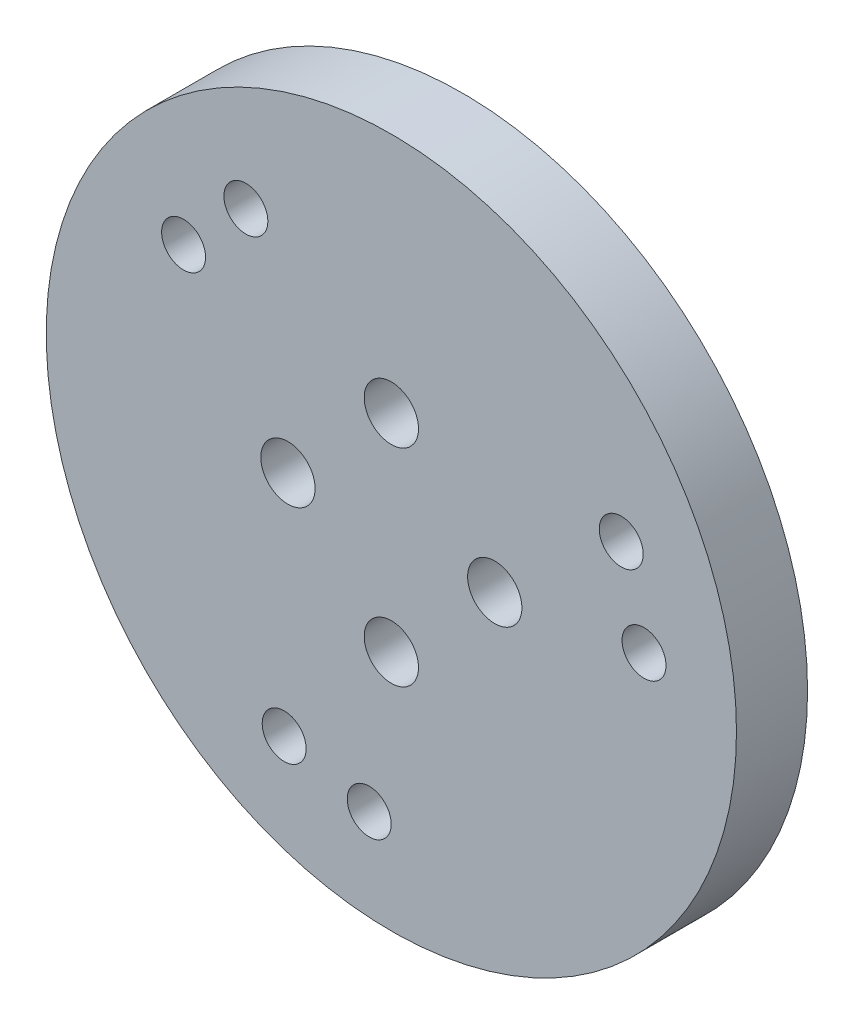
ISO-10303-21;
HEADER;
FILE_DESCRIPTION(('STEP AP214'),'2;1');
FILE_NAME('part.step','',(''),(''),'','','');
FILE_SCHEMA(('AUTOMOTIVE_DESIGN { 1 0 10303 214 1 1 1 1 }'));
ENDSEC;
DATA;
#1=APPLICATION_CONTEXT('core data for automotive mechanical design processes');
#2=APPLICATION_PROTOCOL_DEFINITION('international standard','automotive_design',2000,#1);
#3=PRODUCT_CONTEXT('',#1,'mechanical');
#4=PRODUCT('Part','Part','',(#3));
#5=PRODUCT_RELATED_PRODUCT_CATEGORY('part','',(#4));
#6=PRODUCT_DEFINITION_FORMATION('','',#4);
#7=PRODUCT_DEFINITION_CONTEXT('part definition',#1,'design');
#8=PRODUCT_DEFINITION('design','',#6,#7);
#9=PRODUCT_DEFINITION_SHAPE('','',#8);
#10=(LENGTH_UNIT() NAMED_UNIT(*) SI_UNIT(.MILLI.,.METRE.));
#11=(NAMED_UNIT(*) PLANE_ANGLE_UNIT() SI_UNIT($,.RADIAN.));
#12=(NAMED_UNIT(*) SI_UNIT($,.STERADIAN.) SOLID_ANGLE_UNIT());
#13=UNCERTAINTY_MEASURE_WITH_UNIT(LENGTH_MEASURE(1.E-05),#10,'distance_accuracy_value','');
#14=(GEOMETRIC_REPRESENTATION_CONTEXT(3) GLOBAL_UNCERTAINTY_ASSIGNED_CONTEXT((#13)) GLOBAL_UNIT_ASSIGNED_CONTEXT((#10,
#11,#12)) REPRESENTATION_CONTEXT('',''));
#15=CARTESIAN_POINT('',(0.,0.,0.));
#16=DIRECTION('',(0.,0.,1.));
#17=DIRECTION('',(1.,0.,0.));
#18=AXIS2_PLACEMENT_3D('',#15,#16,#17);
#19=CARTESIAN_POINT('',(-11.2547168340798,16.0734014130389,12.5));
#20=DIRECTION('',(0.,0.,-1.));
#21=DIRECTION('',(-1.,0.,0.));
#22=AXIS2_PLACEMENT_3D('',#19,#20,#21);
#23=CYLINDRICAL_SURFACE('',#22,1.7);
#24=CARTESIAN_POINT('',(-11.2547168340798,16.0734014130389,12.5));
#25=DIRECTION('',(0.,0.,1.));
#26=DIRECTION('',(1.,0.,0.));
#27=AXIS2_PLACEMENT_3D('',#24,#25,#26);
#28=CIRCLE('',#27,1.7);
#29=CARTESIAN_POINT('',(-9.55471683407982,16.0734014130389,12.5));
#30=VERTEX_POINT('',#29);
#31=EDGE_CURVE('E123',#30,#30,#28,.T.);
#32=ORIENTED_EDGE('',*,*,#31,.T.);
#33=EDGE_LOOP('',(#32));
#34=FACE_BOUND('',#33,.T.);
#35=CARTESIAN_POINT('',(-11.2547168340798,16.0734014130389,9.5));
#36=DIRECTION('',(0.,0.,-1.));
#37=DIRECTION('',(-1.,0.,0.));
#38=AXIS2_PLACEMENT_3D('',#35,#36,#37);
#39=CIRCLE('',#38,1.7);
#40=CARTESIAN_POINT('',(-12.9547168340798,16.0734014130389,9.5));
#41=VERTEX_POINT('',#40);
#42=EDGE_CURVE('E82',#41,#41,#39,.T.);
#43=ORIENTED_EDGE('',*,*,#42,.T.);
#44=EDGE_LOOP('',(#43));
#45=FACE_BOUND('',#44,.T.);
#46=ADVANCED_FACE('F33',(#34,#45),#23,.F.);
#47=CARTESIAN_POINT('',(-16.0734014130383,11.2547168340806,12.5));
#48=DIRECTION('',(0.,0.,-1.));
#49=DIRECTION('',(-1.,0.,0.));
#50=AXIS2_PLACEMENT_3D('',#47,#48,#49);
#51=CYLINDRICAL_SURFACE('',#50,1.7);
#52=CARTESIAN_POINT('',(-16.0734014130383,11.2547168340806,12.5));
#53=DIRECTION('',(0.,0.,1.));
#54=DIRECTION('',(1.,0.,0.));
#55=AXIS2_PLACEMENT_3D('',#52,#53,#54);
#56=CIRCLE('',#55,1.7);
#57=CARTESIAN_POINT('',(-14.3734014130383,11.2547168340806,12.5));
#58=VERTEX_POINT('',#57);
#59=EDGE_CURVE('E131',#58,#58,#56,.T.);
#60=ORIENTED_EDGE('',*,*,#59,.T.);
#61=EDGE_LOOP('',(#60));
#62=FACE_BOUND('',#61,.T.);
#63=CARTESIAN_POINT('',(-16.0734014130383,11.2547168340806,9.5));
#64=DIRECTION('',(0.,0.,-1.));
#65=DIRECTION('',(-1.,0.,0.));
#66=AXIS2_PLACEMENT_3D('',#63,#64,#65);
#67=CIRCLE('',#66,1.7);
#68=CARTESIAN_POINT('',(-17.7734014130383,11.2547168340806,9.5));
#69=VERTEX_POINT('',#68);
#70=EDGE_CURVE('E79',#69,#69,#67,.T.);
#71=ORIENTED_EDGE('',*,*,#70,.T.);
#72=EDGE_LOOP('',(#71));
#73=FACE_BOUND('',#72,.T.);
#74=ADVANCED_FACE('F201',(#62,#73),#51,.F.);
#75=CARTESIAN_POINT('',(19.5473323659569,1.71016998419536,12.5));
#76=DIRECTION('',(0.,0.,-1.));
#77=DIRECTION('',(-1.,0.,0.));
#78=AXIS2_PLACEMENT_3D('',#75,#76,#77);
#79=CYLINDRICAL_SURFACE('',#78,1.70000000000149);
#80=CARTESIAN_POINT('',(19.5473323659569,1.71016998419536,12.5));
#81=DIRECTION('',(0.,0.,1.));
#82=DIRECTION('',(1.,0.,0.));
#83=AXIS2_PLACEMENT_3D('',#80,#81,#82);
#84=CIRCLE('',#83,1.70000000000149);
#85=CARTESIAN_POINT('',(21.2473323659584,1.71016998419536,12.5));
#86=VERTEX_POINT('',#85);
#87=EDGE_CURVE('E119',#86,#86,#84,.T.);
#88=ORIENTED_EDGE('',*,*,#87,.T.);
#89=EDGE_LOOP('',(#88));
#90=FACE_BOUND('',#89,.T.);
#91=CARTESIAN_POINT('',(19.5473323659569,1.71016998419536,9.5));
#92=DIRECTION('',(0.,0.,-1.));
#93=DIRECTION('',(-1.,0.,0.));
#94=AXIS2_PLACEMENT_3D('',#91,#92,#93);
#95=CIRCLE('',#94,1.70000000000149);
#96=CARTESIAN_POINT('',(17.8473323659554,1.71016998419536,9.5));
#97=VERTEX_POINT('',#96);
#98=EDGE_CURVE('E76',#97,#97,#95,.T.);
#99=ORIENTED_EDGE('',*,*,#98,.T.);
#100=EDGE_LOOP('',(#99));
#101=FACE_BOUND('',#100,.T.);
#102=ADVANCED_FACE('F207',(#90,#101),#79,.F.);
#103=CARTESIAN_POINT('',(-8.29261553187502,-17.7835713972328,12.5));
#104=DIRECTION('',(0.,0.,-1.));
#105=DIRECTION('',(-1.,0.,0.));
#106=AXIS2_PLACEMENT_3D('',#103,#104,#105);
#107=CYLINDRICAL_SURFACE('',#106,1.70000000000115);
#108=CARTESIAN_POINT('',(-8.29261553187502,-17.7835713972328,12.5));
#109=DIRECTION('',(0.,0.,1.));
#110=DIRECTION('',(1.,0.,0.));
#111=AXIS2_PLACEMENT_3D('',#108,#109,#110);
#112=CIRCLE('',#111,1.70000000000115);
#113=CARTESIAN_POINT('',(-6.59261553187387,-17.7835713972328,12.5));
#114=VERTEX_POINT('',#113);
#115=EDGE_CURVE('E115',#114,#114,#112,.T.);
#116=ORIENTED_EDGE('',*,*,#115,.T.);
#117=EDGE_LOOP('',(#116));
#118=FACE_BOUND('',#117,.T.);
#119=CARTESIAN_POINT('',(-8.29261553187502,-17.7835713972328,9.5));
#120=DIRECTION('',(0.,0.,-1.));
#121=DIRECTION('',(-1.,0.,0.));
#122=AXIS2_PLACEMENT_3D('',#119,#120,#121);
#123=CIRCLE('',#122,1.70000000000115);
#124=CARTESIAN_POINT('',(-9.99261553187616,-17.7835713972328,9.5));
#125=VERTEX_POINT('',#124);
#126=EDGE_CURVE('E72',#125,#125,#123,.T.);
#127=ORIENTED_EDGE('',*,*,#126,.T.);
#128=EDGE_LOOP('',(#127));
#129=FACE_BOUND('',#128,.T.);
#130=ADVANCED_FACE('F496',(#118,#129),#107,.F.);
#131=CARTESIAN_POINT('',(-1.71016998419358,-19.5473323659561,12.5));
#132=DIRECTION('',(0.,0.,-1.));
#133=DIRECTION('',(-1.,0.,0.));
#134=AXIS2_PLACEMENT_3D('',#131,#132,#133);
#135=CYLINDRICAL_SURFACE('',#134,1.70000000000112);
#136=CARTESIAN_POINT('',(-1.71016998419358,-19.5473323659561,12.5));
#137=DIRECTION('',(0.,0.,1.));
#138=DIRECTION('',(1.,0.,0.));
#139=AXIS2_PLACEMENT_3D('',#136,#137,#138);
#140=CIRCLE('',#139,1.70000000000112);
#141=CARTESIAN_POINT('',(-0.0101699841924586,-19.5473323659561,12.5));
#142=VERTEX_POINT('',#141);
#143=EDGE_CURVE('E67',#142,#142,#140,.T.);
#144=ORIENTED_EDGE('',*,*,#143,.T.);
#145=EDGE_LOOP('',(#144));
#146=FACE_BOUND('',#145,.T.);
#147=CARTESIAN_POINT('',(-1.71016998419358,-19.5473323659561,9.5));
#148=DIRECTION('',(0.,0.,-1.));
#149=DIRECTION('',(-1.,0.,0.));
#150=AXIS2_PLACEMENT_3D('',#147,#148,#149);
#151=CIRCLE('',#150,1.70000000000112);
#152=CARTESIAN_POINT('',(-3.41016998419469,-19.5473323659561,9.5));
#153=VERTEX_POINT('',#152);
#154=EDGE_CURVE('E69',#153,#153,#151,.T.);
#155=ORIENTED_EDGE('',*,*,#154,.T.);
#156=EDGE_LOOP('',(#155));
#157=FACE_BOUND('',#156,.T.);
#158=ADVANCED_FACE('F487',(#146,#157),#135,.F.);
#159=CARTESIAN_POINT('',(17.783571397234,8.29261553187689,12.5));
#160=DIRECTION('',(0.,0.,-1.));
#161=DIRECTION('',(-1.,0.,0.));
#162=AXIS2_PLACEMENT_3D('',#159,#160,#161);
#163=CYLINDRICAL_SURFACE('',#162,1.70000000000148);
#164=CARTESIAN_POINT('',(17.783571397234,8.29261553187689,12.5));
#165=DIRECTION('',(0.,0.,1.));
#166=DIRECTION('',(1.,0.,0.));
#167=AXIS2_PLACEMENT_3D('',#164,#165,#166);
#168=CIRCLE('',#167,1.70000000000148);
#169=CARTESIAN_POINT('',(19.4835713972354,8.29261553187689,12.5));
#170=VERTEX_POINT('',#169);
#171=EDGE_CURVE('E135',#170,#170,#168,.T.);
#172=ORIENTED_EDGE('',*,*,#171,.T.);
#173=EDGE_LOOP('',(#172));
#174=FACE_BOUND('',#173,.T.);
#175=CARTESIAN_POINT('',(17.783571397234,8.29261553187689,9.5));
#176=DIRECTION('',(0.,0.,-1.));
#177=DIRECTION('',(-1.,0.,0.));
#178=AXIS2_PLACEMENT_3D('',#175,#176,#177);
#179=CIRCLE('',#178,1.70000000000148);
#180=CARTESIAN_POINT('',(16.0835713972325,8.29261553187689,9.5));
#181=VERTEX_POINT('',#180);
#182=EDGE_CURVE('E64',#181,#181,#179,.T.);
#183=ORIENTED_EDGE('',*,*,#182,.T.);
#184=EDGE_LOOP('',(#183));
#185=FACE_BOUND('',#184,.T.);
#186=ADVANCED_FACE('F464',(#174,#185),#163,.F.);
#187=CARTESIAN_POINT('',(8.00000000000027,2.75810479722345E-13,7.));
#188=DIRECTION('',(0.,0.,-1.));
#189=DIRECTION('',(-1.,0.,0.));
#190=AXIS2_PLACEMENT_3D('',#187,#188,#189);
#191=CYLINDRICAL_SURFACE('',#190,1.10000000000009);
#192=CARTESIAN_POINT('',(8.00000000000027,2.75810479722345E-13,5.));
#193=DIRECTION('',(0.,0.,1.));
#194=DIRECTION('',(1.,0.,0.));
#195=AXIS2_PLACEMENT_3D('',#192,#193,#194);
#196=CIRCLE('',#195,1.10000000000009);
#197=CARTESIAN_POINT('',(9.10000000000036,2.75810479722345E-13,5.));
#198=VERTEX_POINT('',#197);
#199=EDGE_CURVE('E61',#198,#198,#196,.T.);
#200=ORIENTED_EDGE('',*,*,#199,.T.);
#201=EDGE_LOOP('',(#200));
#202=FACE_BOUND('',#201,.T.);
#203=CARTESIAN_POINT('',(8.00000000000027,2.75810479722345E-13,1.6));
#204=DIRECTION('',(0.,0.,-1.));
#205=DIRECTION('',(-1.,0.,0.));
#206=AXIS2_PLACEMENT_3D('',#203,#204,#205);
#207=CIRCLE('',#206,1.10000000000009);
#208=CARTESIAN_POINT('',(6.90000000000019,2.75810479722345E-13,1.6));
#209=VERTEX_POINT('',#208);
#210=EDGE_CURVE('E173',#209,#209,#207,.T.);
#211=ORIENTED_EDGE('',*,*,#210,.T.);
#212=EDGE_LOOP('',(#211));
#213=FACE_BOUND('',#212,.T.);
#214=ADVANCED_FACE('F457',(#202,#213),#191,.F.);
#215=CARTESIAN_POINT('',(5.5162095944469E-13,-8.,7.));
#216=DIRECTION('',(0.,0.,-1.));
#217=DIRECTION('',(-1.,0.,0.));
#218=AXIS2_PLACEMENT_3D('',#215,#216,#217);
#219=CYLINDRICAL_SURFACE('',#218,1.10000000000014);
#220=CARTESIAN_POINT('',(5.5162095944469E-13,-8.,5.));
#221=DIRECTION('',(0.,0.,1.));
#222=DIRECTION('',(1.,0.,0.));
#223=AXIS2_PLACEMENT_3D('',#220,#221,#222);
#224=CIRCLE('',#223,1.10000000000014);
#225=CARTESIAN_POINT('',(1.10000000000069,-8.,5.));
#226=VERTEX_POINT('',#225);
#227=EDGE_CURVE('E57',#226,#226,#224,.T.);
#228=ORIENTED_EDGE('',*,*,#227,.T.);
#229=EDGE_LOOP('',(#228));
#230=FACE_BOUND('',#229,.T.);
#231=CARTESIAN_POINT('',(5.5162095944469E-13,-8.,1.6));
#232=DIRECTION('',(0.,0.,-1.));
#233=DIRECTION('',(-1.,0.,0.));
#234=AXIS2_PLACEMENT_3D('',#231,#232,#233);
#235=CIRCLE('',#234,1.10000000000014);
#236=CARTESIAN_POINT('',(-1.09999999999958,-8.,1.6));
#237=VERTEX_POINT('',#236);
#238=EDGE_CURVE('E170',#237,#237,#235,.T.);
#239=ORIENTED_EDGE('',*,*,#238,.T.);
#240=EDGE_LOOP('',(#239));
#241=FACE_BOUND('',#240,.T.);
#242=ADVANCED_FACE('F448',(#230,#241),#219,.F.);
#243=CARTESIAN_POINT('',(-7.99999999999972,-2.76790197161663E-13,7.));
#244=DIRECTION('',(0.,0.,-1.));
#245=DIRECTION('',(-1.,0.,0.));
#246=AXIS2_PLACEMENT_3D('',#243,#244,#245);
#247=CYLINDRICAL_SURFACE('',#246,1.10000000000022);
#248=CARTESIAN_POINT('',(-7.99999999999972,-2.76790197161663E-13,5.));
#249=DIRECTION('',(0.,0.,1.));
#250=DIRECTION('',(1.,0.,0.));
#251=AXIS2_PLACEMENT_3D('',#248,#249,#250);
#252=CIRCLE('',#251,1.10000000000022);
#253=CARTESIAN_POINT('',(-6.89999999999951,-2.76790197161663E-13,5.));
#254=VERTEX_POINT('',#253);
#255=EDGE_CURVE('E54',#254,#254,#252,.T.);
#256=ORIENTED_EDGE('',*,*,#255,.T.);
#257=EDGE_LOOP('',(#256));
#258=FACE_BOUND('',#257,.T.);
#259=CARTESIAN_POINT('',(-7.99999999999972,-2.76790197161663E-13,1.6));
#260=DIRECTION('',(0.,0.,-1.));
#261=DIRECTION('',(-1.,0.,0.));
#262=AXIS2_PLACEMENT_3D('',#259,#260,#261);
#263=CIRCLE('',#262,1.10000000000022);
#264=CARTESIAN_POINT('',(-9.09999999999994,-2.76790197161663E-13,1.6));
#265=VERTEX_POINT('',#264);
#266=EDGE_CURVE('E167',#265,#265,#263,.T.);
#267=ORIENTED_EDGE('',*,*,#266,.T.);
#268=EDGE_LOOP('',(#267));
#269=FACE_BOUND('',#268,.T.);
#270=ADVANCED_FACE('F439',(#258,#269),#247,.F.);
#271=CARTESIAN_POINT('',(0.,8.,7.));
#272=DIRECTION('',(0.,0.,-1.));
#273=DIRECTION('',(-1.,0.,0.));
#274=AXIS2_PLACEMENT_3D('',#271,#272,#273);
#275=CYLINDRICAL_SURFACE('',#274,1.1);
#276=CARTESIAN_POINT('',(0.,8.,5.));
#277=DIRECTION('',(0.,0.,1.));
#278=DIRECTION('',(1.,0.,0.));
#279=AXIS2_PLACEMENT_3D('',#276,#277,#278);
#280=CIRCLE('',#279,1.1);
#281=CARTESIAN_POINT('',(1.1,8.,5.));
#282=VERTEX_POINT('',#281);
#283=EDGE_CURVE('E46',#282,#282,#280,.T.);
#284=ORIENTED_EDGE('',*,*,#283,.T.);
#285=EDGE_LOOP('',(#284));
#286=FACE_BOUND('',#285,.T.);
#287=CARTESIAN_POINT('',(0.,8.,1.6));
#288=DIRECTION('',(0.,0.,-1.));
#289=DIRECTION('',(-1.,0.,0.));
#290=AXIS2_PLACEMENT_3D('',#287,#288,#289);
#291=CIRCLE('',#290,1.1);
#292=CARTESIAN_POINT('',(-1.1,8.,1.6));
#293=VERTEX_POINT('',#292);
#294=EDGE_CURVE('E162',#293,#293,#291,.T.);
#295=ORIENTED_EDGE('',*,*,#294,.T.);
#296=EDGE_LOOP('',(#295));
#297=FACE_BOUND('',#296,.T.);
#298=ADVANCED_FACE('F432',(#286,#297),#275,.F.);
#299=CARTESIAN_POINT('',(0.,0.,0.));
#300=DIRECTION('',(0.,0.,1.));
#301=DIRECTION('',(1.,0.,0.));
#302=AXIS2_PLACEMENT_3D('',#299,#300,#301);
#303=PLANE('',#302);
#304=CARTESIAN_POINT('',(0.,0.,0.));
#305=DIRECTION('',(0.,0.,-1.));
#306=DIRECTION('',(-1.,0.,0.));
#307=AXIS2_PLACEMENT_3D('',#304,#305,#306);
#308=CIRCLE('',#307,10.);
#309=CARTESIAN_POINT('',(-10.,0.,0.));
#310=VERTEX_POINT('',#309);
#311=EDGE_CURVE('E156',#310,#310,#308,.T.);
#312=ORIENTED_EDGE('',*,*,#311,.F.);
#313=EDGE_LOOP('',(#312));
#314=FACE_BOUND('',#313,.T.);
#315=CARTESIAN_POINT('',(0.,0.,0.));
#316=DIRECTION('',(0.,0.,1.));
#317=DIRECTION('',(1.,0.,0.));
#318=AXIS2_PLACEMENT_3D('',#315,#316,#317);
#319=CIRCLE('',#318,15.);
#320=CARTESIAN_POINT('',(15.,0.,0.));
#321=VERTEX_POINT('',#320);
#322=EDGE_CURVE('E41',#321,#321,#319,.T.);
#323=ORIENTED_EDGE('',*,*,#322,.F.);
#324=EDGE_LOOP('',(#323));
#325=FACE_BOUND('',#324,.T.);
#326=ADVANCED_FACE('F438',(#314,#325),#303,.F.);
#327=CARTESIAN_POINT('',(0.,0.,7.));
#328=DIRECTION('',(0.,0.,-1.));
#329=DIRECTION('',(-1.,0.,0.));
#330=AXIS2_PLACEMENT_3D('',#327,#328,#329);
#331=CYLINDRICAL_SURFACE('',#330,15.);
#332=CARTESIAN_POINT('',(0.,0.,7.));
#333=DIRECTION('',(0.,0.,1.));
#334=DIRECTION('',(1.,0.,0.));
#335=AXIS2_PLACEMENT_3D('',#332,#333,#334);
#336=CIRCLE('',#335,15.);
#337=CARTESIAN_POINT('',(15.,0.,7.));
#338=VERTEX_POINT('',#337);
#339=EDGE_CURVE('E10',#338,#338,#336,.T.);
#340=ORIENTED_EDGE('',*,*,#339,.F.);
#341=EDGE_LOOP('',(#340));
#342=FACE_BOUND('',#341,.T.);
#343=ORIENTED_EDGE('',*,*,#322,.T.);
#344=EDGE_LOOP('',(#343));
#345=FACE_BOUND('',#344,.T.);
#346=ADVANCED_FACE('F35',(#342,#345),#331,.T.);
#347=CARTESIAN_POINT('',(0.,8.,17.));
#348=DIRECTION('',(0.,0.,-1.));
#349=DIRECTION('',(-1.,0.,0.));
#350=AXIS2_PLACEMENT_3D('',#347,#348,#349);
#351=CYLINDRICAL_SURFACE('',#350,2.1);
#352=CARTESIAN_POINT('',(0.,8.,5.));
#353=DIRECTION('',(0.,0.,1.));
#354=DIRECTION('',(1.,0.,0.));
#355=AXIS2_PLACEMENT_3D('',#352,#353,#354);
#356=CIRCLE('',#355,2.1);
#357=CARTESIAN_POINT('',(2.1,8.,5.));
#358=VERTEX_POINT('',#357);
#359=EDGE_CURVE('E49',#358,#358,#356,.T.);
#360=ORIENTED_EDGE('',*,*,#359,.F.);
#361=EDGE_LOOP('',(#360));
#362=FACE_BOUND('',#361,.T.);
#363=CARTESIAN_POINT('',(0.,8.,12.5));
#364=DIRECTION('',(0.,0.,1.));
#365=DIRECTION('',(1.,0.,0.));
#366=AXIS2_PLACEMENT_3D('',#363,#364,#365);
#367=CIRCLE('',#366,2.1);
#368=CARTESIAN_POINT('',(2.1,8.,12.5));
#369=VERTEX_POINT('',#368);
#370=EDGE_CURVE('E90',#369,#369,#367,.T.);
#371=ORIENTED_EDGE('',*,*,#370,.T.);
#372=EDGE_LOOP('',(#371));
#373=FACE_BOUND('',#372,.T.);
#374=ADVANCED_FACE('F197',(#362,#373),#351,.F.);
#375=CARTESIAN_POINT('',(0.,8.,5.));
#376=DIRECTION('',(0.,0.,1.));
#377=DIRECTION('',(1.,0.,0.));
#378=AXIS2_PLACEMENT_3D('',#375,#376,#377);
#379=PLANE('',#378);
#380=ORIENTED_EDGE('',*,*,#283,.F.);
#381=EDGE_LOOP('',(#380));
#382=FACE_BOUND('',#381,.T.);
#383=ORIENTED_EDGE('',*,*,#359,.T.);
#384=EDGE_LOOP('',(#383));
#385=FACE_BOUND('',#384,.T.);
#386=ADVANCED_FACE('F189',(#382,#385),#379,.T.);
#387=CARTESIAN_POINT('',(-7.99999999999977,-2.27373675443232E-13,17.));
#388=DIRECTION('',(0.,0.,-1.));
#389=DIRECTION('',(-1.,0.,0.));
#390=AXIS2_PLACEMENT_3D('',#387,#388,#389);
#391=CYLINDRICAL_SURFACE('',#390,2.10000000000036);
#392=CARTESIAN_POINT('',(-7.99999999999977,-2.27373675443232E-13,5.));
#393=DIRECTION('',(0.,0.,1.));
#394=DIRECTION('',(1.,0.,0.));
#395=AXIS2_PLACEMENT_3D('',#392,#393,#394);
#396=CIRCLE('',#395,2.10000000000036);
#397=CARTESIAN_POINT('',(-5.89999999999941,-2.27373675443232E-13,5.));
#398=VERTEX_POINT('',#397);
#399=EDGE_CURVE('E176',#398,#398,#396,.T.);
#400=ORIENTED_EDGE('',*,*,#399,.F.);
#401=EDGE_LOOP('',(#400));
#402=FACE_BOUND('',#401,.T.);
#403=CARTESIAN_POINT('',(-7.99999999999972,-2.76790197161663E-13,12.5));
#404=DIRECTION('',(0.,0.,1.));
#405=DIRECTION('',(1.,0.,0.));
#406=AXIS2_PLACEMENT_3D('',#403,#404,#405);
#407=CIRCLE('',#406,2.1);
#408=CARTESIAN_POINT('',(-5.89999999999973,-2.76790197161663E-13,12.5));
#409=VERTEX_POINT('',#408);
#410=EDGE_CURVE('E86',#409,#409,#407,.T.);
#411=ORIENTED_EDGE('',*,*,#410,.T.);
#412=EDGE_LOOP('',(#411));
#413=FACE_BOUND('',#412,.T.);
#414=ADVANCED_FACE('F186',(#402,#413),#391,.F.);
#415=CARTESIAN_POINT('',(-7.99999999999977,-2.27373675443232E-13,5.));
#416=DIRECTION('',(0.,0.,1.));
#417=DIRECTION('',(1.,0.,0.));
#418=AXIS2_PLACEMENT_3D('',#415,#416,#417);
#419=PLANE('',#418);
#420=ORIENTED_EDGE('',*,*,#255,.F.);
#421=EDGE_LOOP('',(#420));
#422=FACE_BOUND('',#421,.T.);
#423=ORIENTED_EDGE('',*,*,#399,.T.);
#424=EDGE_LOOP('',(#423));
#425=FACE_BOUND('',#424,.T.);
#426=ADVANCED_FACE('F184',(#422,#425),#419,.T.);
#427=CARTESIAN_POINT('',(4.52787916007828E-13,-8.,17.));
#428=DIRECTION('',(0.,0.,-1.));
#429=DIRECTION('',(-1.,0.,0.));
#430=AXIS2_PLACEMENT_3D('',#427,#428,#429);
#431=CYLINDRICAL_SURFACE('',#430,2.10000000000049);
#432=CARTESIAN_POINT('',(4.52787916007828E-13,-8.,5.));
#433=DIRECTION('',(0.,0.,1.));
#434=DIRECTION('',(1.,0.,0.));
#435=AXIS2_PLACEMENT_3D('',#432,#433,#434);
#436=CIRCLE('',#435,2.10000000000049);
#437=CARTESIAN_POINT('',(2.10000000000094,-8.,5.));
#438=VERTEX_POINT('',#437);
#439=EDGE_CURVE('E179',#438,#438,#436,.T.);
#440=ORIENTED_EDGE('',*,*,#439,.F.);
#441=EDGE_LOOP('',(#440));
#442=FACE_BOUND('',#441,.T.);
#443=CARTESIAN_POINT('',(5.5162095944469E-13,-8.,12.5));
#444=DIRECTION('',(0.,0.,1.));
#445=DIRECTION('',(1.,0.,0.));
#446=AXIS2_PLACEMENT_3D('',#443,#444,#445);
#447=CIRCLE('',#446,2.1);
#448=CARTESIAN_POINT('',(2.10000000000055,-8.,12.5));
#449=VERTEX_POINT('',#448);
#450=EDGE_CURVE('E37',#449,#449,#447,.T.);
#451=ORIENTED_EDGE('',*,*,#450,.T.);
#452=EDGE_LOOP('',(#451));
#453=FACE_BOUND('',#452,.T.);
#454=ADVANCED_FACE('F99',(#442,#453),#431,.F.);
#455=CARTESIAN_POINT('',(4.52787916007828E-13,-8.,5.));
#456=DIRECTION('',(0.,0.,1.));
#457=DIRECTION('',(1.,0.,0.));
#458=AXIS2_PLACEMENT_3D('',#455,#456,#457);
#459=PLANE('',#458);
#460=ORIENTED_EDGE('',*,*,#227,.F.);
#461=EDGE_LOOP('',(#460));
#462=FACE_BOUND('',#461,.T.);
#463=ORIENTED_EDGE('',*,*,#439,.T.);
#464=EDGE_LOOP('',(#463));
#465=FACE_BOUND('',#464,.T.);
#466=ADVANCED_FACE('F240',(#462,#465),#459,.T.);
#467=CARTESIAN_POINT('',(8.00000000000023,2.26393958003914E-13,17.));
#468=DIRECTION('',(0.,0.,-1.));
#469=DIRECTION('',(-1.,0.,0.));
#470=AXIS2_PLACEMENT_3D('',#467,#468,#469);
#471=CYLINDRICAL_SURFACE('',#470,2.10000000000018);
#472=CARTESIAN_POINT('',(8.00000000000023,2.26393958003914E-13,5.));
#473=DIRECTION('',(0.,0.,1.));
#474=DIRECTION('',(1.,0.,0.));
#475=AXIS2_PLACEMENT_3D('',#472,#473,#474);
#476=CIRCLE('',#475,2.10000000000018);
#477=CARTESIAN_POINT('',(10.1000000000004,2.26393958003914E-13,5.));
#478=VERTEX_POINT('',#477);
#479=EDGE_CURVE('E58',#478,#478,#476,.T.);
#480=ORIENTED_EDGE('',*,*,#479,.F.);
#481=EDGE_LOOP('',(#480));
#482=FACE_BOUND('',#481,.T.);
#483=CARTESIAN_POINT('',(8.00000000000027,2.75810479722345E-13,12.5));
#484=DIRECTION('',(0.,0.,1.));
#485=DIRECTION('',(1.,0.,0.));
#486=AXIS2_PLACEMENT_3D('',#483,#484,#485);
#487=CIRCLE('',#486,2.1);
#488=CARTESIAN_POINT('',(10.1000000000003,2.75810479722345E-13,12.5));
#489=VERTEX_POINT('',#488);
#490=EDGE_CURVE('E92',#489,#489,#487,.T.);
#491=ORIENTED_EDGE('',*,*,#490,.T.);
#492=EDGE_LOOP('',(#491));
#493=FACE_BOUND('',#492,.T.);
#494=ADVANCED_FACE('F236',(#482,#493),#471,.F.);
#495=CARTESIAN_POINT('',(8.00000000000023,2.26393958003914E-13,5.));
#496=DIRECTION('',(0.,0.,1.));
#497=DIRECTION('',(1.,0.,0.));
#498=AXIS2_PLACEMENT_3D('',#495,#496,#497);
#499=PLANE('',#498);
#500=ORIENTED_EDGE('',*,*,#199,.F.);
#501=EDGE_LOOP('',(#500));
#502=FACE_BOUND('',#501,.T.);
#503=ORIENTED_EDGE('',*,*,#479,.T.);
#504=EDGE_LOOP('',(#503));
#505=FACE_BOUND('',#504,.T.);
#506=ADVANCED_FACE('F232',(#502,#505),#499,.T.);
#507=CARTESIAN_POINT('',(0.,0.,1.6));
#508=DIRECTION('',(0.,0.,-1.));
#509=DIRECTION('',(-1.,0.,0.));
#510=AXIS2_PLACEMENT_3D('',#507,#508,#509);
#511=CYLINDRICAL_SURFACE('',#510,10.);
#512=CARTESIAN_POINT('',(0.,0.,1.6));
#513=DIRECTION('',(0.,0.,-1.));
#514=DIRECTION('',(-1.,0.,0.));
#515=AXIS2_PLACEMENT_3D('',#512,#513,#514);
#516=CIRCLE('',#515,10.);
#517=CARTESIAN_POINT('',(-10.,0.,1.6));
#518=VERTEX_POINT('',#517);
#519=EDGE_CURVE('E159',#518,#518,#516,.T.);
#520=ORIENTED_EDGE('',*,*,#519,.F.);
#521=EDGE_LOOP('',(#520));
#522=FACE_BOUND('',#521,.T.);
#523=ORIENTED_EDGE('',*,*,#311,.T.);
#524=EDGE_LOOP('',(#523));
#525=FACE_BOUND('',#524,.T.);
#526=ADVANCED_FACE('F228',(#522,#525),#511,.F.);
#527=CARTESIAN_POINT('',(0.,0.,1.6));
#528=DIRECTION('',(0.,0.,-1.));
#529=DIRECTION('',(-1.,0.,0.));
#530=AXIS2_PLACEMENT_3D('',#527,#528,#529);
#531=PLANE('',#530);
#532=CARTESIAN_POINT('',(0.,0.,1.6));
#533=DIRECTION('',(0.,0.,-1.));
#534=DIRECTION('',(-1.,0.,0.));
#535=AXIS2_PLACEMENT_3D('',#532,#533,#534);
#536=CIRCLE('',#535,4.2);
#537=CARTESIAN_POINT('',(-4.2,0.,1.6));
#538=VERTEX_POINT('',#537);
#539=EDGE_CURVE('E150',#538,#538,#536,.T.);
#540=ORIENTED_EDGE('',*,*,#539,.F.);
#541=EDGE_LOOP('',(#540));
#542=FACE_BOUND('',#541,.T.);
#543=ORIENTED_EDGE('',*,*,#210,.F.);
#544=EDGE_LOOP('',(#543));
#545=FACE_BOUND('',#544,.T.);
#546=ORIENTED_EDGE('',*,*,#238,.F.);
#547=EDGE_LOOP('',(#546));
#548=FACE_BOUND('',#547,.T.);
#549=ORIENTED_EDGE('',*,*,#266,.F.);
#550=EDGE_LOOP('',(#549));
#551=FACE_BOUND('',#550,.T.);
#552=ORIENTED_EDGE('',*,*,#294,.F.);
#553=EDGE_LOOP('',(#552));
#554=FACE_BOUND('',#553,.T.);
#555=ORIENTED_EDGE('',*,*,#519,.T.);
#556=EDGE_LOOP('',(#555));
#557=FACE_BOUND('',#556,.T.);
#558=ADVANCED_FACE('F224',(#542,#545,#548,#551,#554,#557),#531,.T.);
#559=CARTESIAN_POINT('',(0.,0.,7.));
#560=DIRECTION('',(0.,0.,-1.));
#561=DIRECTION('',(-1.,0.,0.));
#562=AXIS2_PLACEMENT_3D('',#559,#560,#561);
#563=CYLINDRICAL_SURFACE('',#562,4.2);
#564=CARTESIAN_POINT('',(0.,0.,7.));
#565=DIRECTION('',(0.,0.,-1.));
#566=DIRECTION('',(-1.,0.,0.));
#567=AXIS2_PLACEMENT_3D('',#564,#565,#566);
#568=CIRCLE('',#567,4.2);
#569=CARTESIAN_POINT('',(-4.2,0.,7.));
#570=VERTEX_POINT('',#569);
#571=EDGE_CURVE('E153',#570,#570,#568,.T.);
#572=CARTESIAN_POINT('',(-4.2,0.,7.));
#573=CARTESIAN_POINT('',(-4.2,0.,6.94375));
#574=CARTESIAN_POINT('',(-4.2,0.,6.8875));
#575=CARTESIAN_POINT('',(-4.2,0.,6.775));
#576=CARTESIAN_POINT('',(-4.2,0.,6.71875));
#577=CARTESIAN_POINT('',(-4.2,0.,6.60625));
#578=CARTESIAN_POINT('',(-4.2,0.,6.55));
#579=CARTESIAN_POINT('',(-4.2,0.,6.4375));
#580=CARTESIAN_POINT('',(-4.2,0.,6.38125));
#581=CARTESIAN_POINT('',(-4.2,0.,6.26875));
#582=CARTESIAN_POINT('',(-4.2,0.,6.2125));
#583=CARTESIAN_POINT('',(-4.2,0.,6.1));
#584=CARTESIAN_POINT('',(-4.2,0.,6.04375));
#585=CARTESIAN_POINT('',(-4.2,0.,5.93125));
#586=CARTESIAN_POINT('',(-4.2,0.,5.875));
#587=CARTESIAN_POINT('',(-4.2,0.,5.7625));
#588=CARTESIAN_POINT('',(-4.2,0.,5.70625));
#589=CARTESIAN_POINT('',(-4.2,0.,5.59375));
#590=CARTESIAN_POINT('',(-4.2,0.,5.5375));
#591=CARTESIAN_POINT('',(-4.2,0.,5.425));
#592=CARTESIAN_POINT('',(-4.2,0.,5.36875));
#593=CARTESIAN_POINT('',(-4.2,0.,5.25625));
#594=CARTESIAN_POINT('',(-4.2,0.,5.2));
#595=CARTESIAN_POINT('',(-4.2,0.,5.0875));
#596=CARTESIAN_POINT('',(-4.2,0.,5.03125));
#597=CARTESIAN_POINT('',(-4.2,0.,4.91875));
#598=CARTESIAN_POINT('',(-4.2,0.,4.8625));
#599=CARTESIAN_POINT('',(-4.2,0.,4.75));
#600=CARTESIAN_POINT('',(-4.2,0.,4.69375));
#601=CARTESIAN_POINT('',(-4.2,0.,4.58125));
#602=CARTESIAN_POINT('',(-4.2,0.,4.525));
#603=CARTESIAN_POINT('',(-4.2,0.,4.4125));
#604=CARTESIAN_POINT('',(-4.2,0.,4.35625));
#605=CARTESIAN_POINT('',(-4.2,0.,4.24375));
#606=CARTESIAN_POINT('',(-4.2,0.,4.1875));
#607=CARTESIAN_POINT('',(-4.2,0.,4.075));
#608=CARTESIAN_POINT('',(-4.2,0.,4.01875));
#609=CARTESIAN_POINT('',(-4.2,0.,3.90625));
#610=CARTESIAN_POINT('',(-4.2,0.,3.85));
#611=CARTESIAN_POINT('',(-4.2,0.,3.7375));
#612=CARTESIAN_POINT('',(-4.2,0.,3.68125));
#613=CARTESIAN_POINT('',(-4.2,0.,3.56875));
#614=CARTESIAN_POINT('',(-4.2,0.,3.5125));
#615=CARTESIAN_POINT('',(-4.2,0.,3.4));
#616=CARTESIAN_POINT('',(-4.2,0.,3.34375));
#617=CARTESIAN_POINT('',(-4.2,0.,3.23125));
#618=CARTESIAN_POINT('',(-4.2,0.,3.175));
#619=CARTESIAN_POINT('',(-4.2,0.,3.0625));
#620=CARTESIAN_POINT('',(-4.2,0.,3.00625));
#621=CARTESIAN_POINT('',(-4.2,0.,2.89375));
#622=CARTESIAN_POINT('',(-4.2,0.,2.8375));
#623=CARTESIAN_POINT('',(-4.2,0.,2.725));
#624=CARTESIAN_POINT('',(-4.2,0.,2.66875));
#625=CARTESIAN_POINT('',(-4.2,0.,2.55625));
#626=CARTESIAN_POINT('',(-4.2,0.,2.5));
#627=CARTESIAN_POINT('',(-4.2,0.,2.3875));
#628=CARTESIAN_POINT('',(-4.2,0.,2.33125));
#629=CARTESIAN_POINT('',(-4.2,0.,2.21875));
#630=CARTESIAN_POINT('',(-4.2,0.,2.1625));
#631=CARTESIAN_POINT('',(-4.2,0.,2.05));
#632=CARTESIAN_POINT('',(-4.2,0.,1.99375));
#633=CARTESIAN_POINT('',(-4.2,0.,1.88125));
#634=CARTESIAN_POINT('',(-4.2,0.,1.825));
#635=CARTESIAN_POINT('',(-4.2,0.,1.7125));
#636=CARTESIAN_POINT('',(-4.2,0.,1.65625));
#637=CARTESIAN_POINT('',(-4.2,0.,1.6));
#638=B_SPLINE_CURVE_WITH_KNOTS('',3,(#572,#573,#574,#575,#576,#577,#578,#579,#580,#581,#582,
#583,#584,#585,#586,#587,#588,#589,#590,#591,#592,#593,#594,#595,#596,#597,#598,#599,#600,#601,
#602,#603,#604,#605,#606,#607,#608,#609,#610,#611,#612,#613,#614,#615,#616,#617,#618,#619,#620,
#621,#622,#623,#624,#625,#626,#627,#628,#629,#630,#631,#632,#633,#634,#635,#636,#637),
.UNSPECIFIED.,.F.,.F.,(4,2,2,2,2,2,2,2,2,2,2,2,2,2,2,2,2,2,2,2,2,2,2,2,2,2,2,2,2,2,2,2,4),(0.,
0.16875,0.337499999999999,0.50625,0.674999999999999,0.84375,1.0125,1.18125,1.35,1.51875,1.6875,
1.85625,2.025,2.19375,2.3625,2.53125,2.7,2.86875,3.0375,3.20625,3.375,3.54375,3.7125,3.88125,
4.05,4.21875,4.3875,4.55625,4.725,4.89375,5.0625,5.23125,5.4),.UNSPECIFIED.);
#639=EDGE_CURVE('BSEAM221',#570,#538,#638,.T.);
#640=ORIENTED_EDGE('',*,*,#571,.F.);
#641=ORIENTED_EDGE('',*,*,#539,.T.);
#642=ORIENTED_EDGE('',*,*,#639,.T.);
#643=ORIENTED_EDGE('',*,*,#639,.F.);
#644=EDGE_LOOP('',(#640,#642,#641,#643));
#645=FACE_BOUND('',#644,.T.);
#646=ADVANCED_FACE('F221',(#645),#563,.F.);
#647=CARTESIAN_POINT('',(0.,0.,7.));
#648=DIRECTION('',(0.,0.,1.));
#649=DIRECTION('',(1.,0.,0.));
#650=AXIS2_PLACEMENT_3D('',#647,#648,#649);
#651=PLANE('',#650);
#652=ORIENTED_EDGE('',*,*,#571,.T.);
#653=EDGE_LOOP('',(#652));
#654=FACE_BOUND('',#653,.T.);
#655=ADVANCED_FACE('F215',(#654),#651,.F.);
#656=CARTESIAN_POINT('',(-8.29261553187502,-17.7835713972328,7.));
#657=DIRECTION('',(0.,0.,-1.));
#658=DIRECTION('',(-1.,0.,0.));
#659=AXIS2_PLACEMENT_3D('',#656,#657,#658);
#660=CIRCLE('',#659,3.);
#661=CARTESIAN_POINT('',(-11.292615531875,-17.7835713972328,7.));
#662=VERTEX_POINT('',#661);
#663=EDGE_CURVE('E89',#662,#662,#660,.T.);
#664=ORIENTED_EDGE('',*,*,#663,.F.);
#665=EDGE_LOOP('',(#664));
#666=FACE_BOUND('',#665,.T.);
#667=CARTESIAN_POINT('',(-1.71016998419358,-19.5473323659561,7.));
#668=DIRECTION('',(0.,0.,-1.));
#669=DIRECTION('',(-1.,0.,0.));
#670=AXIS2_PLACEMENT_3D('',#667,#668,#669);
#671=CIRCLE('',#670,3.);
#672=CARTESIAN_POINT('',(-4.71016998419358,-19.5473323659561,7.));
#673=VERTEX_POINT('',#672);
#674=EDGE_CURVE('E623',#673,#673,#671,.T.);
#675=ORIENTED_EDGE('',*,*,#674,.F.);
#676=EDGE_LOOP('',(#675));
#677=FACE_BOUND('',#676,.T.);
#678=CARTESIAN_POINT('',(-16.0734014130383,11.2547168340806,7.));
#679=DIRECTION('',(0.,0.,-1.));
#680=DIRECTION('',(-1.,0.,0.));
#681=AXIS2_PLACEMENT_3D('',#678,#679,#680);
#682=CIRCLE('',#681,3.);
#683=CARTESIAN_POINT('',(-19.0734014130383,11.2547168340806,7.));
#684=VERTEX_POINT('',#683);
#685=EDGE_CURVE('E613',#684,#684,#682,.T.);
#686=ORIENTED_EDGE('',*,*,#685,.F.);
#687=EDGE_LOOP('',(#686));
#688=FACE_BOUND('',#687,.T.);
#689=CARTESIAN_POINT('',(-11.2547168340798,16.0734014130389,7.));
#690=DIRECTION('',(0.,0.,-1.));
#691=DIRECTION('',(-1.,0.,0.));
#692=AXIS2_PLACEMENT_3D('',#689,#690,#691);
#693=CIRCLE('',#692,3.);
#694=CARTESIAN_POINT('',(-14.2547168340798,16.0734014130389,7.));
#695=VERTEX_POINT('',#694);
#696=EDGE_CURVE('E597',#695,#695,#693,.T.);
#697=ORIENTED_EDGE('',*,*,#696,.F.);
#698=EDGE_LOOP('',(#697));
#699=FACE_BOUND('',#698,.T.);
#700=CARTESIAN_POINT('',(19.5473323659569,1.71016998419536,7.));
#701=DIRECTION('',(0.,0.,-1.));
#702=DIRECTION('',(-1.,0.,0.));
#703=AXIS2_PLACEMENT_3D('',#700,#701,#702);
#704=CIRCLE('',#703,3.);
#705=CARTESIAN_POINT('',(16.5473323659569,1.71016998419536,7.));
#706=VERTEX_POINT('',#705);
#707=EDGE_CURVE('E587',#706,#706,#704,.T.);
#708=ORIENTED_EDGE('',*,*,#707,.F.);
#709=EDGE_LOOP('',(#708));
#710=FACE_BOUND('',#709,.T.);
#711=CARTESIAN_POINT('',(17.783571397234,8.29261553187689,7.));
#712=DIRECTION('',(0.,0.,-1.));
#713=DIRECTION('',(-1.,0.,0.));
#714=AXIS2_PLACEMENT_3D('',#711,#712,#713);
#715=CIRCLE('',#714,3.);
#716=CARTESIAN_POINT('',(14.783571397234,8.29261553187689,7.));
#717=VERTEX_POINT('',#716);
#718=EDGE_CURVE('E85',#717,#717,#715,.T.);
#719=ORIENTED_EDGE('',*,*,#718,.F.);
#720=EDGE_LOOP('',(#719));
#721=FACE_BOUND('',#720,.T.);
#722=CARTESIAN_POINT('',(0.,0.,7.));
#723=DIRECTION('',(0.,0.,1.));
#724=DIRECTION('',(1.,0.,0.));
#725=AXIS2_PLACEMENT_3D('',#722,#723,#724);
#726=CIRCLE('',#725,26.7);
#727=CARTESIAN_POINT('',(26.7,0.,7.));
#728=VERTEX_POINT('',#727);
#729=EDGE_CURVE('E148',#728,#728,#726,.T.);
#730=ORIENTED_EDGE('',*,*,#729,.F.);
#731=EDGE_LOOP('',(#730));
#732=FACE_BOUND('',#731,.T.);
#733=ORIENTED_EDGE('',*,*,#339,.T.);
#734=EDGE_LOOP('',(#733));
#735=FACE_BOUND('',#734,.T.);
#736=ADVANCED_FACE('F105',(#666,#677,#688,#699,#710,#721,#732,#735),#651,.F.);
#737=CARTESIAN_POINT('',(0.,0.,12.5));
#738=DIRECTION('',(0.,0.,1.));
#739=DIRECTION('',(1.,0.,0.));
#740=AXIS2_PLACEMENT_3D('',#737,#738,#739);
#741=PLANE('',#740);
#742=ORIENTED_EDGE('',*,*,#450,.F.);
#743=EDGE_LOOP('',(#742));
#744=FACE_BOUND('',#743,.T.);
#745=ORIENTED_EDGE('',*,*,#490,.F.);
#746=EDGE_LOOP('',(#745));
#747=FACE_BOUND('',#746,.T.);
#748=ORIENTED_EDGE('',*,*,#370,.F.);
#749=EDGE_LOOP('',(#748));
#750=FACE_BOUND('',#749,.T.);
#751=ORIENTED_EDGE('',*,*,#410,.F.);
#752=EDGE_LOOP('',(#751));
#753=FACE_BOUND('',#752,.T.);
#754=ORIENTED_EDGE('',*,*,#115,.F.);
#755=EDGE_LOOP('',(#754));
#756=FACE_BOUND('',#755,.T.);
#757=ORIENTED_EDGE('',*,*,#87,.F.);
#758=EDGE_LOOP('',(#757));
#759=FACE_BOUND('',#758,.T.);
#760=ORIENTED_EDGE('',*,*,#31,.F.);
#761=EDGE_LOOP('',(#760));
#762=FACE_BOUND('',#761,.T.);
#763=CARTESIAN_POINT('',(0.,0.,12.5));
#764=DIRECTION('',(0.,0.,1.));
#765=DIRECTION('',(1.,0.,0.));
#766=AXIS2_PLACEMENT_3D('',#763,#764,#765);
#767=CIRCLE('',#766,26.7);
#768=CARTESIAN_POINT('',(26.7,0.,12.5));
#769=VERTEX_POINT('',#768);
#770=EDGE_CURVE('E127',#769,#769,#767,.T.);
#771=ORIENTED_EDGE('',*,*,#770,.T.);
#772=EDGE_LOOP('',(#771));
#773=FACE_BOUND('',#772,.T.);
#774=ORIENTED_EDGE('',*,*,#59,.F.);
#775=EDGE_LOOP('',(#774));
#776=FACE_BOUND('',#775,.T.);
#777=ORIENTED_EDGE('',*,*,#171,.F.);
#778=EDGE_LOOP('',(#777));
#779=FACE_BOUND('',#778,.T.);
#780=ORIENTED_EDGE('',*,*,#143,.F.);
#781=EDGE_LOOP('',(#780));
#782=FACE_BOUND('',#781,.T.);
#783=ADVANCED_FACE('F101',(#744,#747,#750,#753,#756,#759,#762,#773,#776,#779,#782),#741,.T.);
#784=CARTESIAN_POINT('',(0.,0.,12.5));
#785=DIRECTION('',(0.,0.,-1.));
#786=DIRECTION('',(-1.,0.,0.));
#787=AXIS2_PLACEMENT_3D('',#784,#785,#786);
#788=CYLINDRICAL_SURFACE('',#787,26.7);
#789=ORIENTED_EDGE('',*,*,#770,.F.);
#790=EDGE_LOOP('',(#789));
#791=FACE_BOUND('',#790,.T.);
#792=ORIENTED_EDGE('',*,*,#729,.T.);
#793=EDGE_LOOP('',(#792));
#794=FACE_BOUND('',#793,.T.);
#795=ADVANCED_FACE('F104',(#791,#794),#788,.T.);
#796=CARTESIAN_POINT('',(17.783571397234,8.29261553187689,9.5));
#797=DIRECTION('',(0.,0.,-1.));
#798=DIRECTION('',(-1.,0.,0.));
#799=AXIS2_PLACEMENT_3D('',#796,#797,#798);
#800=CYLINDRICAL_SURFACE('',#799,3.);
#801=CARTESIAN_POINT('',(17.783571397234,8.29261553187689,9.5));
#802=DIRECTION('',(0.,0.,-1.));
#803=DIRECTION('',(-1.,0.,0.));
#804=AXIS2_PLACEMENT_3D('',#801,#802,#803);
#805=CIRCLE('',#804,3.);
#806=CARTESIAN_POINT('',(14.783571397234,8.29261553187689,9.5));
#807=VERTEX_POINT('',#806);
#808=EDGE_CURVE('E68',#807,#807,#805,.T.);
#809=ORIENTED_EDGE('',*,*,#808,.F.);
#810=EDGE_LOOP('',(#809));
#811=FACE_BOUND('',#810,.T.);
#812=ORIENTED_EDGE('',*,*,#718,.T.);
#813=EDGE_LOOP('',(#812));
#814=FACE_BOUND('',#813,.T.);
#815=ADVANCED_FACE('F219',(#811,#814),#800,.F.);
#816=CARTESIAN_POINT('',(17.783571397234,8.29261553187689,9.5));
#817=DIRECTION('',(0.,0.,-1.));
#818=DIRECTION('',(-1.,0.,0.));
#819=AXIS2_PLACEMENT_3D('',#816,#817,#818);
#820=PLANE('',#819);
#821=ORIENTED_EDGE('',*,*,#182,.F.);
#822=EDGE_LOOP('',(#821));
#823=FACE_BOUND('',#822,.T.);
#824=ORIENTED_EDGE('',*,*,#808,.T.);
#825=EDGE_LOOP('',(#824));
#826=FACE_BOUND('',#825,.T.);
#827=ADVANCED_FACE('F304',(#823,#826),#820,.T.);
#828=CARTESIAN_POINT('',(-1.71016998419358,-19.5473323659561,9.5));
#829=DIRECTION('',(0.,0.,-1.));
#830=DIRECTION('',(-1.,0.,0.));
#831=AXIS2_PLACEMENT_3D('',#828,#829,#830);
#832=CYLINDRICAL_SURFACE('',#831,3.);
#833=CARTESIAN_POINT('',(-1.71016998419358,-19.5473323659561,9.5));
#834=DIRECTION('',(0.,0.,-1.));
#835=DIRECTION('',(-1.,0.,0.));
#836=AXIS2_PLACEMENT_3D('',#833,#834,#835);
#837=CIRCLE('',#836,3.);
#838=CARTESIAN_POINT('',(-4.71016998419358,-19.5473323659561,9.5));
#839=VERTEX_POINT('',#838);
#840=EDGE_CURVE('E618',#839,#839,#837,.T.);
#841=ORIENTED_EDGE('',*,*,#840,.F.);
#842=EDGE_LOOP('',(#841));
#843=FACE_BOUND('',#842,.T.);
#844=ORIENTED_EDGE('',*,*,#674,.T.);
#845=EDGE_LOOP('',(#844));
#846=FACE_BOUND('',#845,.T.);
#847=ADVANCED_FACE('F312',(#843,#846),#832,.F.);
#848=CARTESIAN_POINT('',(-1.71016998419358,-19.5473323659561,9.5));
#849=DIRECTION('',(0.,0.,-1.));
#850=DIRECTION('',(-1.,0.,0.));
#851=AXIS2_PLACEMENT_3D('',#848,#849,#850);
#852=PLANE('',#851);
#853=ORIENTED_EDGE('',*,*,#154,.F.);
#854=EDGE_LOOP('',(#853));
#855=FACE_BOUND('',#854,.T.);
#856=ORIENTED_EDGE('',*,*,#840,.T.);
#857=EDGE_LOOP('',(#856));
#858=FACE_BOUND('',#857,.T.);
#859=ADVANCED_FACE('F320',(#855,#858),#852,.T.);
#860=CARTESIAN_POINT('',(-8.29261553187502,-17.7835713972328,9.5));
#861=DIRECTION('',(0.,0.,-1.));
#862=DIRECTION('',(-1.,0.,0.));
#863=AXIS2_PLACEMENT_3D('',#860,#861,#862);
#864=CYLINDRICAL_SURFACE('',#863,3.);
#865=CARTESIAN_POINT('',(-8.29261553187502,-17.7835713972328,9.5));
#866=DIRECTION('',(0.,0.,-1.));
#867=DIRECTION('',(-1.,0.,0.));
#868=AXIS2_PLACEMENT_3D('',#865,#866,#867);
#869=CIRCLE('',#868,3.);
#870=CARTESIAN_POINT('',(-11.292615531875,-17.7835713972328,9.5));
#871=VERTEX_POINT('',#870);
#872=EDGE_CURVE('E625',#871,#871,#869,.T.);
#873=ORIENTED_EDGE('',*,*,#872,.F.);
#874=EDGE_LOOP('',(#873));
#875=FACE_BOUND('',#874,.T.);
#876=ORIENTED_EDGE('',*,*,#663,.T.);
#877=EDGE_LOOP('',(#876));
#878=FACE_BOUND('',#877,.T.);
#879=ADVANCED_FACE('F328',(#875,#878),#864,.F.);
#880=CARTESIAN_POINT('',(-8.29261553187502,-17.7835713972328,9.5));
#881=DIRECTION('',(0.,0.,-1.));
#882=DIRECTION('',(-1.,0.,0.));
#883=AXIS2_PLACEMENT_3D('',#880,#881,#882);
#884=PLANE('',#883);
#885=ORIENTED_EDGE('',*,*,#126,.F.);
#886=EDGE_LOOP('',(#885));
#887=FACE_BOUND('',#886,.T.);
#888=ORIENTED_EDGE('',*,*,#872,.T.);
#889=EDGE_LOOP('',(#888));
#890=FACE_BOUND('',#889,.T.);
#891=ADVANCED_FACE('F336',(#887,#890),#884,.T.);
#892=CARTESIAN_POINT('',(19.5473323659569,1.71016998419536,9.5));
#893=DIRECTION('',(0.,0.,-1.));
#894=DIRECTION('',(-1.,0.,0.));
#895=AXIS2_PLACEMENT_3D('',#892,#893,#894);
#896=CYLINDRICAL_SURFACE('',#895,3.);
#897=CARTESIAN_POINT('',(19.5473323659569,1.71016998419536,9.5));
#898=DIRECTION('',(0.,0.,-1.));
#899=DIRECTION('',(-1.,0.,0.));
#900=AXIS2_PLACEMENT_3D('',#897,#898,#899);
#901=CIRCLE('',#900,3.);
#902=CARTESIAN_POINT('',(16.5473323659569,1.71016998419536,9.5));
#903=VERTEX_POINT('',#902);
#904=EDGE_CURVE('E73',#903,#903,#901,.T.);
#905=ORIENTED_EDGE('',*,*,#904,.F.);
#906=EDGE_LOOP('',(#905));
#907=FACE_BOUND('',#906,.T.);
#908=ORIENTED_EDGE('',*,*,#707,.T.);
#909=EDGE_LOOP('',(#908));
#910=FACE_BOUND('',#909,.T.);
#911=ADVANCED_FACE('F344',(#907,#910),#896,.F.);
#912=CARTESIAN_POINT('',(19.5473323659569,1.71016998419536,9.5));
#913=DIRECTION('',(0.,0.,-1.));
#914=DIRECTION('',(-1.,0.,0.));
#915=AXIS2_PLACEMENT_3D('',#912,#913,#914);
#916=PLANE('',#915);
#917=ORIENTED_EDGE('',*,*,#98,.F.);
#918=EDGE_LOOP('',(#917));
#919=FACE_BOUND('',#918,.T.);
#920=ORIENTED_EDGE('',*,*,#904,.T.);
#921=EDGE_LOOP('',(#920));
#922=FACE_BOUND('',#921,.T.);
#923=ADVANCED_FACE('F352',(#919,#922),#916,.T.);
#924=CARTESIAN_POINT('',(-16.0734014130383,11.2547168340806,9.5));
#925=DIRECTION('',(0.,0.,-1.));
#926=DIRECTION('',(-1.,0.,0.));
#927=AXIS2_PLACEMENT_3D('',#924,#925,#926);
#928=CYLINDRICAL_SURFACE('',#927,3.);
#929=CARTESIAN_POINT('',(-16.0734014130383,11.2547168340806,9.5));
#930=DIRECTION('',(0.,0.,-1.));
#931=DIRECTION('',(-1.,0.,0.));
#932=AXIS2_PLACEMENT_3D('',#929,#930,#931);
#933=CIRCLE('',#932,3.);
#934=CARTESIAN_POINT('',(-19.0734014130383,11.2547168340806,9.5));
#935=VERTEX_POINT('',#934);
#936=EDGE_CURVE('E599',#935,#935,#933,.T.);
#937=ORIENTED_EDGE('',*,*,#936,.F.);
#938=EDGE_LOOP('',(#937));
#939=FACE_BOUND('',#938,.T.);
#940=ORIENTED_EDGE('',*,*,#685,.T.);
#941=EDGE_LOOP('',(#940));
#942=FACE_BOUND('',#941,.T.);
#943=ADVANCED_FACE('F360',(#939,#942),#928,.F.);
#944=CARTESIAN_POINT('',(-16.0734014130383,11.2547168340806,9.5));
#945=DIRECTION('',(0.,0.,-1.));
#946=DIRECTION('',(-1.,0.,0.));
#947=AXIS2_PLACEMENT_3D('',#944,#945,#946);
#948=PLANE('',#947);
#949=ORIENTED_EDGE('',*,*,#70,.F.);
#950=EDGE_LOOP('',(#949));
#951=FACE_BOUND('',#950,.T.);
#952=ORIENTED_EDGE('',*,*,#936,.T.);
#953=EDGE_LOOP('',(#952));
#954=FACE_BOUND('',#953,.T.);
#955=ADVANCED_FACE('F368',(#951,#954),#948,.T.);
#956=CARTESIAN_POINT('',(-11.2547168340798,16.0734014130389,9.5));
#957=DIRECTION('',(0.,0.,-1.));
#958=DIRECTION('',(-1.,0.,0.));
#959=AXIS2_PLACEMENT_3D('',#956,#957,#958);
#960=CYLINDRICAL_SURFACE('',#959,3.);
#961=CARTESIAN_POINT('',(-11.2547168340798,16.0734014130389,9.5));
#962=DIRECTION('',(0.,0.,-1.));
#963=DIRECTION('',(-1.,0.,0.));
#964=AXIS2_PLACEMENT_3D('',#961,#962,#963);
#965=CIRCLE('',#964,3.);
#966=CARTESIAN_POINT('',(-14.2547168340798,16.0734014130389,9.5));
#967=VERTEX_POINT('',#966);
#968=EDGE_CURVE('E590',#967,#967,#965,.T.);
#969=ORIENTED_EDGE('',*,*,#968,.F.);
#970=EDGE_LOOP('',(#969));
#971=FACE_BOUND('',#970,.T.);
#972=ORIENTED_EDGE('',*,*,#696,.T.);
#973=EDGE_LOOP('',(#972));
#974=FACE_BOUND('',#973,.T.);
#975=ADVANCED_FACE('F376',(#971,#974),#960,.F.);
#976=CARTESIAN_POINT('',(-11.2547168340798,16.0734014130389,9.5));
#977=DIRECTION('',(0.,0.,-1.));
#978=DIRECTION('',(-1.,0.,0.));
#979=AXIS2_PLACEMENT_3D('',#976,#977,#978);
#980=PLANE('',#979);
#981=ORIENTED_EDGE('',*,*,#42,.F.);
#982=EDGE_LOOP('',(#981));
#983=FACE_BOUND('',#982,.T.);
#984=ORIENTED_EDGE('',*,*,#968,.T.);
#985=EDGE_LOOP('',(#984));
#986=FACE_BOUND('',#985,.T.);
#987=ADVANCED_FACE('F384',(#983,#986),#980,.T.);
#988=CLOSED_SHELL('',(#46,#74,#102,#130,#158,#186,#214,#242,#270,#298,#326,#346,#374,#386,#414,
#426,#454,#466,#494,#506,#526,#558,#646,#655,#736,#783,#795,#815,#827,#847,#859,#879,#891,#911,
#923,#943,#955,#975,#987));
#989=MANIFOLD_SOLID_BREP('B2',#988);
#990=ADVANCED_BREP_SHAPE_REPRESENTATION('',(#18,#989),#14);
#991=SHAPE_DEFINITION_REPRESENTATION(#9,#990);
ENDSEC;
END-ISO-10303-21;
